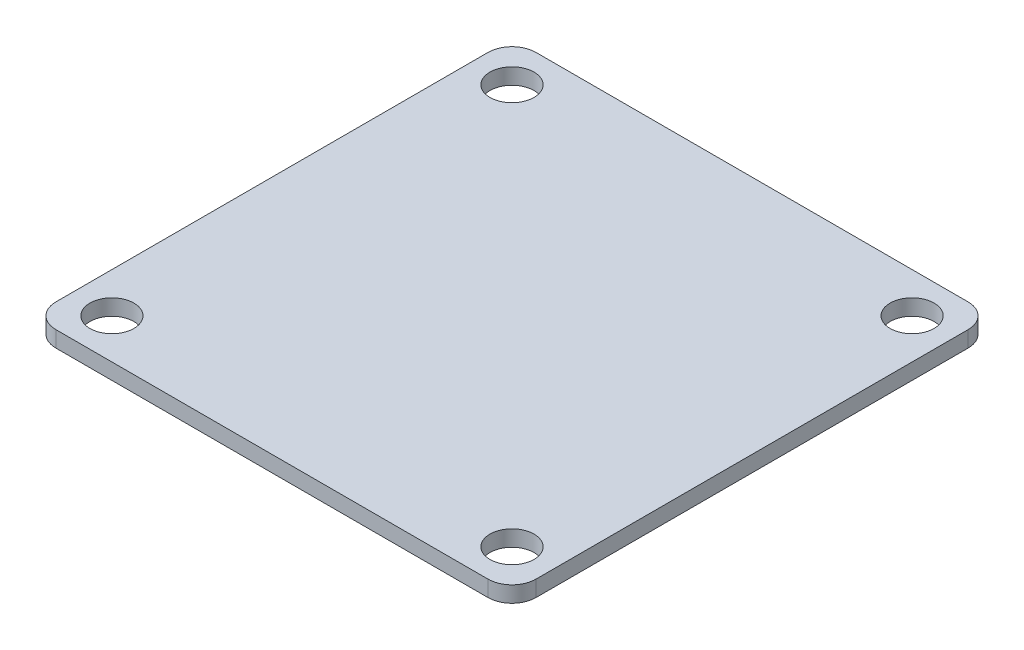
ISO-10303-21;
HEADER;
FILE_DESCRIPTION(('STEP AP214'),'2;1');
FILE_NAME('part.step','',(''),(''),'','','');
FILE_SCHEMA(('AUTOMOTIVE_DESIGN { 1 0 10303 214 1 1 1 1 }'));
ENDSEC;
DATA;
#1=APPLICATION_CONTEXT('core data for automotive mechanical design processes');
#2=APPLICATION_PROTOCOL_DEFINITION('international standard','automotive_design',2000,#1);
#3=PRODUCT_CONTEXT('',#1,'mechanical');
#4=PRODUCT('Part','Part','',(#3));
#5=PRODUCT_RELATED_PRODUCT_CATEGORY('part','',(#4));
#6=PRODUCT_DEFINITION_FORMATION('','',#4);
#7=PRODUCT_DEFINITION_CONTEXT('part definition',#1,'design');
#8=PRODUCT_DEFINITION('design','',#6,#7);
#9=PRODUCT_DEFINITION_SHAPE('','',#8);
#10=(LENGTH_UNIT() NAMED_UNIT(*) SI_UNIT(.MILLI.,.METRE.));
#11=(NAMED_UNIT(*) PLANE_ANGLE_UNIT() SI_UNIT($,.RADIAN.));
#12=(NAMED_UNIT(*) SI_UNIT($,.STERADIAN.) SOLID_ANGLE_UNIT());
#13=UNCERTAINTY_MEASURE_WITH_UNIT(LENGTH_MEASURE(1.E-05),#10,'distance_accuracy_value','');
#14=(GEOMETRIC_REPRESENTATION_CONTEXT(3) GLOBAL_UNCERTAINTY_ASSIGNED_CONTEXT((#13)) GLOBAL_UNIT_ASSIGNED_CONTEXT((#10,
#11,#12)) REPRESENTATION_CONTEXT('',''));
#15=CARTESIAN_POINT('',(0.,0.,0.));
#16=DIRECTION('',(0.,0.,1.));
#17=DIRECTION('',(1.,0.,0.));
#18=AXIS2_PLACEMENT_3D('',#15,#16,#17);
#19=CARTESIAN_POINT('',(57.,2.,-57.));
#20=DIRECTION('',(0.,1.,0.));
#21=DIRECTION('',(0.,0.,1.));
#22=AXIS2_PLACEMENT_3D('',#19,#20,#21);
#23=PLANE('',#22);
#24=CARTESIAN_POINT('',(55.,2.,-5.00000000000001));
#25=DIRECTION('',(0.,1.,0.));
#26=DIRECTION('',(0.,0.,1.));
#27=AXIS2_PLACEMENT_3D('',#24,#25,#26);
#28=CIRCLE('',#27,2.75);
#29=CARTESIAN_POINT('',(55.,2.,-2.25000000000002));
#30=VERTEX_POINT('',#29);
#31=EDGE_CURVE('E188',#30,#30,#28,.T.);
#32=ORIENTED_EDGE('',*,*,#31,.F.);
#33=EDGE_LOOP('',(#32));
#34=FACE_BOUND('',#33,.T.);
#35=CARTESIAN_POINT('',(5.,2.,-55.));
#36=DIRECTION('',(0.,1.,0.));
#37=DIRECTION('',(0.,0.,1.));
#38=AXIS2_PLACEMENT_3D('',#35,#36,#37);
#39=CIRCLE('',#38,2.75);
#40=CARTESIAN_POINT('',(5.,2.,-52.25));
#41=VERTEX_POINT('',#40);
#42=EDGE_CURVE('E134',#41,#41,#39,.T.);
#43=ORIENTED_EDGE('',*,*,#42,.F.);
#44=EDGE_LOOP('',(#43));
#45=FACE_BOUND('',#44,.T.);
#46=CARTESIAN_POINT('',(57.,2.,-57.));
#47=DIRECTION('',(0.,1.,0.));
#48=DIRECTION('',(0.,0.,1.));
#49=AXIS2_PLACEMENT_3D('',#46,#47,#48);
#50=CIRCLE('',#49,3.);
#51=CARTESIAN_POINT('',(60.,2.,-57.));
#52=VERTEX_POINT('',#51);
#53=CARTESIAN_POINT('',(57.,2.,-60.));
#54=VERTEX_POINT('',#53);
#55=EDGE_CURVE('E145',#52,#54,#50,.T.);
#56=ORIENTED_EDGE('',*,*,#55,.T.);
#57=DIRECTION('',(-1.,0.,0.));
#58=VECTOR('',#57,1.);
#59=CARTESIAN_POINT('',(3.00000000000002,2.,-60.));
#60=LINE('',#59,#58);
#61=CARTESIAN_POINT('',(3.,2.,-60.));
#62=VERTEX_POINT('',#61);
#63=EDGE_CURVE('E93',#54,#62,#60,.T.);
#64=ORIENTED_EDGE('',*,*,#63,.T.);
#65=CARTESIAN_POINT('',(3.,2.,-57.));
#66=DIRECTION('',(0.,1.,0.));
#67=DIRECTION('',(0.,0.,-1.));
#68=AXIS2_PLACEMENT_3D('',#65,#66,#67);
#69=CIRCLE('',#68,3.);
#70=CARTESIAN_POINT('',(0.,2.,-57.));
#71=VERTEX_POINT('',#70);
#72=EDGE_CURVE('E160',#62,#71,#69,.T.);
#73=ORIENTED_EDGE('',*,*,#72,.T.);
#74=DIRECTION('',(0.,0.,1.));
#75=VECTOR('',#74,1.);
#76=CARTESIAN_POINT('',(0.,2.,-3.00000000000002));
#77=LINE('',#76,#75);
#78=CARTESIAN_POINT('',(0.,2.,-3.00000000000002));
#79=VERTEX_POINT('',#78);
#80=EDGE_CURVE('E173',#71,#79,#77,.T.);
#81=ORIENTED_EDGE('',*,*,#80,.T.);
#82=CARTESIAN_POINT('',(3.,2.,-3.));
#83=DIRECTION('',(0.,1.,0.));
#84=DIRECTION('',(0.,0.,-1.));
#85=AXIS2_PLACEMENT_3D('',#82,#83,#84);
#86=CIRCLE('',#85,3.);
#87=CARTESIAN_POINT('',(3.00000000000002,2.,0.));
#88=VERTEX_POINT('',#87);
#89=EDGE_CURVE('E112',#79,#88,#86,.T.);
#90=ORIENTED_EDGE('',*,*,#89,.T.);
#91=DIRECTION('',(1.,0.,0.));
#92=VECTOR('',#91,1.);
#93=CARTESIAN_POINT('',(57.,2.,0.));
#94=LINE('',#93,#92);
#95=CARTESIAN_POINT('',(57.,2.,0.));
#96=VERTEX_POINT('',#95);
#97=EDGE_CURVE('E106',#88,#96,#94,.T.);
#98=ORIENTED_EDGE('',*,*,#97,.T.);
#99=CARTESIAN_POINT('',(57.,2.,-3.));
#100=DIRECTION('',(0.,1.,0.));
#101=DIRECTION('',(0.,0.,1.));
#102=AXIS2_PLACEMENT_3D('',#99,#100,#101);
#103=CIRCLE('',#102,3.);
#104=CARTESIAN_POINT('',(60.,2.,-3.00000000000002));
#105=VERTEX_POINT('',#104);
#106=EDGE_CURVE('E110',#96,#105,#103,.T.);
#107=ORIENTED_EDGE('',*,*,#106,.T.);
#108=DIRECTION('',(0.,0.,-1.));
#109=VECTOR('',#108,1.);
#110=CARTESIAN_POINT('',(60.,2.,-57.));
#111=LINE('',#110,#109);
#112=EDGE_CURVE('E50',#105,#52,#111,.T.);
#113=ORIENTED_EDGE('',*,*,#112,.T.);
#114=EDGE_LOOP('',(#56,#64,#73,#81,#90,#98,#107,#113));
#115=FACE_BOUND('',#114,.T.);
#116=CARTESIAN_POINT('',(5.,2.,-4.99999999999998));
#117=DIRECTION('',(0.,1.,0.));
#118=DIRECTION('',(0.,0.,-1.));
#119=AXIS2_PLACEMENT_3D('',#116,#117,#118);
#120=CIRCLE('',#119,2.75);
#121=CARTESIAN_POINT('',(5.,2.,-7.74999999999998));
#122=VERTEX_POINT('',#121);
#123=EDGE_CURVE('E182',#122,#122,#120,.T.);
#124=ORIENTED_EDGE('',*,*,#123,.F.);
#125=EDGE_LOOP('',(#124));
#126=FACE_BOUND('',#125,.T.);
#127=CARTESIAN_POINT('',(55.,2.,-55.));
#128=DIRECTION('',(0.,1.,0.));
#129=DIRECTION('',(0.,0.,-1.));
#130=AXIS2_PLACEMENT_3D('',#127,#128,#129);
#131=CIRCLE('',#130,2.75);
#132=CARTESIAN_POINT('',(55.,2.,-57.75));
#133=VERTEX_POINT('',#132);
#134=EDGE_CURVE('E194',#133,#133,#131,.T.);
#135=ORIENTED_EDGE('',*,*,#134,.F.);
#136=EDGE_LOOP('',(#135));
#137=FACE_BOUND('',#136,.T.);
#138=ADVANCED_FACE('F33',(#34,#45,#115,#126,#137),#23,.T.);
#139=CARTESIAN_POINT('',(57.,0.,-57.));
#140=DIRECTION('',(0.,1.,0.));
#141=DIRECTION('',(0.,0.,1.));
#142=AXIS2_PLACEMENT_3D('',#139,#140,#141);
#143=PLANE('',#142);
#144=CARTESIAN_POINT('',(57.,0.,-57.));
#145=DIRECTION('',(0.,1.,0.));
#146=DIRECTION('',(0.,0.,1.));
#147=AXIS2_PLACEMENT_3D('',#144,#145,#146);
#148=CIRCLE('',#147,3.);
#149=CARTESIAN_POINT('',(60.,0.,-57.));
#150=VERTEX_POINT('',#149);
#151=CARTESIAN_POINT('',(57.,0.,-60.));
#152=VERTEX_POINT('',#151);
#153=EDGE_CURVE('E130',#150,#152,#148,.T.);
#154=ORIENTED_EDGE('',*,*,#153,.F.);
#155=DIRECTION('',(0.,0.,-1.));
#156=VECTOR('',#155,1.);
#157=CARTESIAN_POINT('',(60.,0.,-57.));
#158=LINE('',#157,#156);
#159=CARTESIAN_POINT('',(60.,0.,-3.00000000000002));
#160=VERTEX_POINT('',#159);
#161=EDGE_CURVE('E85',#160,#150,#158,.T.);
#162=ORIENTED_EDGE('',*,*,#161,.F.);
#163=CARTESIAN_POINT('',(57.,0.,-3.));
#164=DIRECTION('',(0.,1.,0.));
#165=DIRECTION('',(0.,0.,1.));
#166=AXIS2_PLACEMENT_3D('',#163,#164,#165);
#167=CIRCLE('',#166,3.);
#168=CARTESIAN_POINT('',(57.,0.,0.));
#169=VERTEX_POINT('',#168);
#170=EDGE_CURVE('E79',#169,#160,#167,.T.);
#171=ORIENTED_EDGE('',*,*,#170,.F.);
#172=DIRECTION('',(1.,0.,0.));
#173=VECTOR('',#172,1.);
#174=CARTESIAN_POINT('',(57.,0.,0.));
#175=LINE('',#174,#173);
#176=CARTESIAN_POINT('',(3.00000000000002,0.,0.));
#177=VERTEX_POINT('',#176);
#178=EDGE_CURVE('E120',#177,#169,#175,.T.);
#179=ORIENTED_EDGE('',*,*,#178,.F.);
#180=CARTESIAN_POINT('',(3.,0.,-3.));
#181=DIRECTION('',(0.,1.,0.));
#182=DIRECTION('',(0.,0.,-1.));
#183=AXIS2_PLACEMENT_3D('',#180,#181,#182);
#184=CIRCLE('',#183,3.);
#185=CARTESIAN_POINT('',(0.,0.,-3.00000000000002));
#186=VERTEX_POINT('',#185);
#187=EDGE_CURVE('E140',#186,#177,#184,.T.);
#188=ORIENTED_EDGE('',*,*,#187,.F.);
#189=DIRECTION('',(0.,0.,1.));
#190=VECTOR('',#189,1.);
#191=CARTESIAN_POINT('',(0.,0.,-3.00000000000002));
#192=LINE('',#191,#190);
#193=CARTESIAN_POINT('',(0.,0.,-57.));
#194=VERTEX_POINT('',#193);
#195=EDGE_CURVE('E138',#194,#186,#192,.T.);
#196=ORIENTED_EDGE('',*,*,#195,.F.);
#197=CARTESIAN_POINT('',(3.,0.,-57.));
#198=DIRECTION('',(0.,1.,0.));
#199=DIRECTION('',(0.,0.,-1.));
#200=AXIS2_PLACEMENT_3D('',#197,#198,#199);
#201=CIRCLE('',#200,3.);
#202=CARTESIAN_POINT('',(3.,0.,-60.));
#203=VERTEX_POINT('',#202);
#204=EDGE_CURVE('E136',#203,#194,#201,.T.);
#205=ORIENTED_EDGE('',*,*,#204,.F.);
#206=DIRECTION('',(-1.,0.,0.));
#207=VECTOR('',#206,1.);
#208=CARTESIAN_POINT('',(3.00000000000002,0.,-60.));
#209=LINE('',#208,#207);
#210=EDGE_CURVE('E133',#152,#203,#209,.T.);
#211=ORIENTED_EDGE('',*,*,#210,.F.);
#212=EDGE_LOOP('',(#154,#162,#171,#179,#188,#196,#205,#211));
#213=FACE_BOUND('',#212,.T.);
#214=CARTESIAN_POINT('',(5.,0.,-55.));
#215=DIRECTION('',(0.,1.,0.));
#216=DIRECTION('',(0.,0.,1.));
#217=AXIS2_PLACEMENT_3D('',#214,#215,#216);
#218=CIRCLE('',#217,2.75);
#219=CARTESIAN_POINT('',(5.,0.,-52.25));
#220=VERTEX_POINT('',#219);
#221=EDGE_CURVE('E179',#220,#220,#218,.T.);
#222=ORIENTED_EDGE('',*,*,#221,.T.);
#223=EDGE_LOOP('',(#222));
#224=FACE_BOUND('',#223,.T.);
#225=CARTESIAN_POINT('',(5.,0.,-4.99999999999998));
#226=DIRECTION('',(0.,1.,0.));
#227=DIRECTION('',(0.,0.,-1.));
#228=AXIS2_PLACEMENT_3D('',#225,#226,#227);
#229=CIRCLE('',#228,2.75);
#230=CARTESIAN_POINT('',(5.,0.,-7.74999999999998));
#231=VERTEX_POINT('',#230);
#232=EDGE_CURVE('E185',#231,#231,#229,.T.);
#233=ORIENTED_EDGE('',*,*,#232,.T.);
#234=EDGE_LOOP('',(#233));
#235=FACE_BOUND('',#234,.T.);
#236=CARTESIAN_POINT('',(55.,0.,-5.00000000000001));
#237=DIRECTION('',(0.,1.,0.));
#238=DIRECTION('',(0.,0.,1.));
#239=AXIS2_PLACEMENT_3D('',#236,#237,#238);
#240=CIRCLE('',#239,2.75);
#241=CARTESIAN_POINT('',(55.,0.,-2.25000000000002));
#242=VERTEX_POINT('',#241);
#243=EDGE_CURVE('E191',#242,#242,#240,.T.);
#244=ORIENTED_EDGE('',*,*,#243,.T.);
#245=EDGE_LOOP('',(#244));
#246=FACE_BOUND('',#245,.T.);
#247=CARTESIAN_POINT('',(55.,0.,-55.));
#248=DIRECTION('',(0.,1.,0.));
#249=DIRECTION('',(0.,0.,-1.));
#250=AXIS2_PLACEMENT_3D('',#247,#248,#249);
#251=CIRCLE('',#250,2.75);
#252=CARTESIAN_POINT('',(55.,0.,-57.75));
#253=VERTEX_POINT('',#252);
#254=EDGE_CURVE('E197',#253,#253,#251,.T.);
#255=ORIENTED_EDGE('',*,*,#254,.T.);
#256=EDGE_LOOP('',(#255));
#257=FACE_BOUND('',#256,.T.);
#258=ADVANCED_FACE('F164',(#213,#224,#235,#246,#257),#143,.F.);
#259=CARTESIAN_POINT('',(57.,2.,-57.));
#260=DIRECTION('',(0.,-1.,0.));
#261=DIRECTION('',(0.,0.,-1.));
#262=AXIS2_PLACEMENT_3D('',#259,#260,#261);
#263=CYLINDRICAL_SURFACE('',#262,3.);
#264=ORIENTED_EDGE('',*,*,#153,.T.);
#265=DIRECTION('',(0.,-1.,0.));
#266=VECTOR('',#265,1.);
#267=CARTESIAN_POINT('',(57.,2.,-60.));
#268=LINE('',#267,#266);
#269=EDGE_CURVE('E11',#54,#152,#268,.T.);
#270=ORIENTED_EDGE('',*,*,#269,.F.);
#271=ORIENTED_EDGE('',*,*,#55,.F.);
#272=DIRECTION('',(0.,-1.,0.));
#273=VECTOR('',#272,1.);
#274=CARTESIAN_POINT('',(60.,2.,-57.));
#275=LINE('',#274,#273);
#276=EDGE_CURVE('E126',#52,#150,#275,.T.);
#277=ORIENTED_EDGE('',*,*,#276,.T.);
#278=EDGE_LOOP('',(#264,#270,#271,#277));
#279=FACE_BOUND('',#278,.T.);
#280=ADVANCED_FACE('F35',(#279),#263,.T.);
#281=CARTESIAN_POINT('',(3.00000000000002,2.,-60.));
#282=DIRECTION('',(0.,0.,1.));
#283=DIRECTION('',(1.,0.,0.));
#284=AXIS2_PLACEMENT_3D('',#281,#282,#283);
#285=PLANE('',#284);
#286=ORIENTED_EDGE('',*,*,#210,.T.);
#287=DIRECTION('',(0.,-1.,0.));
#288=VECTOR('',#287,1.);
#289=CARTESIAN_POINT('',(3.,2.,-60.));
#290=LINE('',#289,#288);
#291=EDGE_CURVE('E42',#62,#203,#290,.T.);
#292=ORIENTED_EDGE('',*,*,#291,.F.);
#293=ORIENTED_EDGE('',*,*,#63,.F.);
#294=ORIENTED_EDGE('',*,*,#269,.T.);
#295=EDGE_LOOP('',(#286,#292,#293,#294));
#296=FACE_BOUND('',#295,.T.);
#297=ADVANCED_FACE('F231',(#296),#285,.F.);
#298=CARTESIAN_POINT('',(3.,2.,-57.));
#299=DIRECTION('',(0.,-1.,0.));
#300=DIRECTION('',(0.,0.,-1.));
#301=AXIS2_PLACEMENT_3D('',#298,#299,#300);
#302=CYLINDRICAL_SURFACE('',#301,3.);
#303=ORIENTED_EDGE('',*,*,#204,.T.);
#304=DIRECTION('',(0.,-1.,0.));
#305=VECTOR('',#304,1.);
#306=CARTESIAN_POINT('',(0.,2.,-57.));
#307=LINE('',#306,#305);
#308=EDGE_CURVE('E152',#71,#194,#307,.T.);
#309=ORIENTED_EDGE('',*,*,#308,.F.);
#310=ORIENTED_EDGE('',*,*,#72,.F.);
#311=ORIENTED_EDGE('',*,*,#291,.T.);
#312=EDGE_LOOP('',(#303,#309,#310,#311));
#313=FACE_BOUND('',#312,.T.);
#314=ADVANCED_FACE('F158',(#313),#302,.T.);
#315=CARTESIAN_POINT('',(0.,2.,-3.00000000000002));
#316=DIRECTION('',(1.,0.,0.));
#317=DIRECTION('',(0.,0.,-1.));
#318=AXIS2_PLACEMENT_3D('',#315,#316,#317);
#319=PLANE('',#318);
#320=ORIENTED_EDGE('',*,*,#195,.T.);
#321=DIRECTION('',(0.,-1.,0.));
#322=VECTOR('',#321,1.);
#323=CARTESIAN_POINT('',(0.,2.,-3.00000000000002));
#324=LINE('',#323,#322);
#325=EDGE_CURVE('E149',#79,#186,#324,.T.);
#326=ORIENTED_EDGE('',*,*,#325,.F.);
#327=ORIENTED_EDGE('',*,*,#80,.F.);
#328=ORIENTED_EDGE('',*,*,#308,.T.);
#329=EDGE_LOOP('',(#320,#326,#327,#328));
#330=FACE_BOUND('',#329,.T.);
#331=ADVANCED_FACE('F169',(#330),#319,.F.);
#332=CARTESIAN_POINT('',(3.,2.,-3.));
#333=DIRECTION('',(0.,-1.,0.));
#334=DIRECTION('',(0.,0.,-1.));
#335=AXIS2_PLACEMENT_3D('',#332,#333,#334);
#336=CYLINDRICAL_SURFACE('',#335,3.);
#337=ORIENTED_EDGE('',*,*,#187,.T.);
#338=DIRECTION('',(0.,-1.,0.));
#339=VECTOR('',#338,1.);
#340=CARTESIAN_POINT('',(3.00000000000002,2.,0.));
#341=LINE('',#340,#339);
#342=EDGE_CURVE('E121',#88,#177,#341,.T.);
#343=ORIENTED_EDGE('',*,*,#342,.F.);
#344=ORIENTED_EDGE('',*,*,#89,.F.);
#345=ORIENTED_EDGE('',*,*,#325,.T.);
#346=EDGE_LOOP('',(#337,#343,#344,#345));
#347=FACE_BOUND('',#346,.T.);
#348=ADVANCED_FACE('F172',(#347),#336,.T.);
#349=CARTESIAN_POINT('',(57.,2.,0.));
#350=DIRECTION('',(0.,0.,-1.));
#351=DIRECTION('',(-1.,0.,0.));
#352=AXIS2_PLACEMENT_3D('',#349,#350,#351);
#353=PLANE('',#352);
#354=ORIENTED_EDGE('',*,*,#178,.T.);
#355=DIRECTION('',(0.,-1.,0.));
#356=VECTOR('',#355,1.);
#357=CARTESIAN_POINT('',(57.,2.,0.));
#358=LINE('',#357,#356);
#359=EDGE_CURVE('E117',#96,#169,#358,.T.);
#360=ORIENTED_EDGE('',*,*,#359,.F.);
#361=ORIENTED_EDGE('',*,*,#97,.F.);
#362=ORIENTED_EDGE('',*,*,#342,.T.);
#363=EDGE_LOOP('',(#354,#360,#361,#362));
#364=FACE_BOUND('',#363,.T.);
#365=ADVANCED_FACE('F118',(#364),#353,.F.);
#366=CARTESIAN_POINT('',(57.,2.,-3.));
#367=DIRECTION('',(0.,-1.,0.));
#368=DIRECTION('',(0.,0.,-1.));
#369=AXIS2_PLACEMENT_3D('',#366,#367,#368);
#370=CYLINDRICAL_SURFACE('',#369,3.);
#371=ORIENTED_EDGE('',*,*,#170,.T.);
#372=DIRECTION('',(0.,-1.,0.));
#373=VECTOR('',#372,1.);
#374=CARTESIAN_POINT('',(60.,2.,-3.00000000000002));
#375=LINE('',#374,#373);
#376=EDGE_CURVE('E122',#105,#160,#375,.T.);
#377=ORIENTED_EDGE('',*,*,#376,.F.);
#378=ORIENTED_EDGE('',*,*,#106,.F.);
#379=ORIENTED_EDGE('',*,*,#359,.T.);
#380=EDGE_LOOP('',(#371,#377,#378,#379));
#381=FACE_BOUND('',#380,.T.);
#382=ADVANCED_FACE('F124',(#381),#370,.T.);
#383=CARTESIAN_POINT('',(60.,2.,-57.));
#384=DIRECTION('',(-1.,0.,0.));
#385=DIRECTION('',(0.,0.,1.));
#386=AXIS2_PLACEMENT_3D('',#383,#384,#385);
#387=PLANE('',#386);
#388=ORIENTED_EDGE('',*,*,#161,.T.);
#389=ORIENTED_EDGE('',*,*,#276,.F.);
#390=ORIENTED_EDGE('',*,*,#112,.F.);
#391=ORIENTED_EDGE('',*,*,#376,.T.);
#392=EDGE_LOOP('',(#388,#389,#390,#391));
#393=FACE_BOUND('',#392,.T.);
#394=ADVANCED_FACE('F219',(#393),#387,.F.);
#395=CARTESIAN_POINT('',(5.,2.,-55.));
#396=DIRECTION('',(0.,-1.,0.));
#397=DIRECTION('',(0.,0.,-1.));
#398=AXIS2_PLACEMENT_3D('',#395,#396,#397);
#399=CYLINDRICAL_SURFACE('',#398,2.75);
#400=ORIENTED_EDGE('',*,*,#42,.T.);
#401=EDGE_LOOP('',(#400));
#402=FACE_BOUND('',#401,.T.);
#403=ORIENTED_EDGE('',*,*,#221,.F.);
#404=EDGE_LOOP('',(#403));
#405=FACE_BOUND('',#404,.T.);
#406=ADVANCED_FACE('F216',(#402,#405),#399,.F.);
#407=CARTESIAN_POINT('',(5.,2.,-4.99999999999998));
#408=DIRECTION('',(0.,-1.,0.));
#409=DIRECTION('',(0.,0.,-1.));
#410=AXIS2_PLACEMENT_3D('',#407,#408,#409);
#411=CYLINDRICAL_SURFACE('',#410,2.75);
#412=ORIENTED_EDGE('',*,*,#123,.T.);
#413=EDGE_LOOP('',(#412));
#414=FACE_BOUND('',#413,.T.);
#415=ORIENTED_EDGE('',*,*,#232,.F.);
#416=EDGE_LOOP('',(#415));
#417=FACE_BOUND('',#416,.T.);
#418=ADVANCED_FACE('F295',(#414,#417),#411,.F.);
#419=CARTESIAN_POINT('',(55.,2.,-5.00000000000001));
#420=DIRECTION('',(0.,-1.,0.));
#421=DIRECTION('',(0.,0.,-1.));
#422=AXIS2_PLACEMENT_3D('',#419,#420,#421);
#423=CYLINDRICAL_SURFACE('',#422,2.75);
#424=ORIENTED_EDGE('',*,*,#31,.T.);
#425=EDGE_LOOP('',(#424));
#426=FACE_BOUND('',#425,.T.);
#427=ORIENTED_EDGE('',*,*,#243,.F.);
#428=EDGE_LOOP('',(#427));
#429=FACE_BOUND('',#428,.T.);
#430=ADVANCED_FACE('F303',(#426,#429),#423,.F.);
#431=CARTESIAN_POINT('',(55.,2.,-55.));
#432=DIRECTION('',(0.,-1.,0.));
#433=DIRECTION('',(0.,0.,-1.));
#434=AXIS2_PLACEMENT_3D('',#431,#432,#433);
#435=CYLINDRICAL_SURFACE('',#434,2.75);
#436=ORIENTED_EDGE('',*,*,#134,.T.);
#437=EDGE_LOOP('',(#436));
#438=FACE_BOUND('',#437,.T.);
#439=ORIENTED_EDGE('',*,*,#254,.F.);
#440=EDGE_LOOP('',(#439));
#441=FACE_BOUND('',#440,.T.);
#442=ADVANCED_FACE('F203',(#438,#441),#435,.F.);
#443=CLOSED_SHELL('',(#138,#258,#280,#297,#314,#331,#348,#365,#382,#394,#406,#418,#430,#442));
#444=MANIFOLD_SOLID_BREP('B2',#443);
#445=ADVANCED_BREP_SHAPE_REPRESENTATION('',(#18,#444),#14);
#446=SHAPE_DEFINITION_REPRESENTATION(#9,#445);
ENDSEC;
END-ISO-10303-21;
